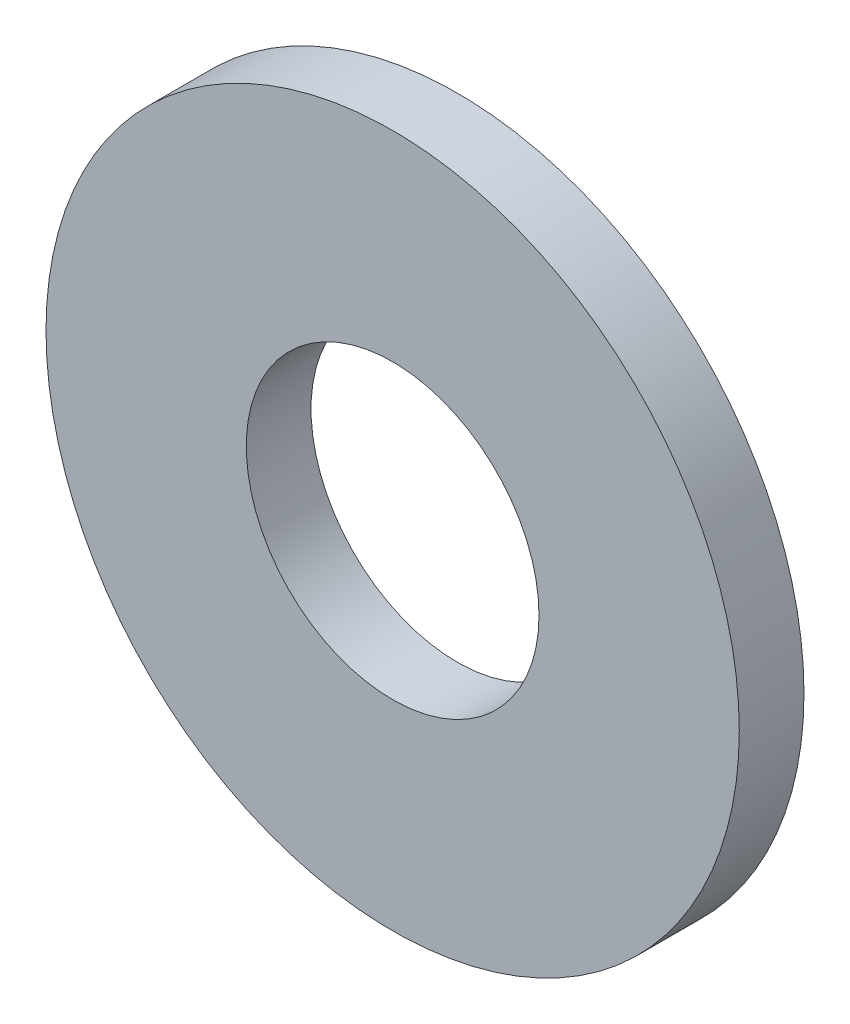
ISO-10303-21;
HEADER;
FILE_DESCRIPTION(('STEP AP214'),'2;1');
FILE_NAME('part.step','',(''),(''),'','','');
FILE_SCHEMA(('AUTOMOTIVE_DESIGN { 1 0 10303 214 1 1 1 1 }'));
ENDSEC;
DATA;
#1=APPLICATION_CONTEXT('core data for automotive mechanical design processes');
#2=APPLICATION_PROTOCOL_DEFINITION('international standard','automotive_design',2000,#1);
#3=PRODUCT_CONTEXT('',#1,'mechanical');
#4=PRODUCT('Part','Part','',(#3));
#5=PRODUCT_RELATED_PRODUCT_CATEGORY('part','',(#4));
#6=PRODUCT_DEFINITION_FORMATION('','',#4);
#7=PRODUCT_DEFINITION_CONTEXT('part definition',#1,'design');
#8=PRODUCT_DEFINITION('design','',#6,#7);
#9=PRODUCT_DEFINITION_SHAPE('','',#8);
#10=(LENGTH_UNIT() NAMED_UNIT(*) SI_UNIT(.MILLI.,.METRE.));
#11=(NAMED_UNIT(*) PLANE_ANGLE_UNIT() SI_UNIT($,.RADIAN.));
#12=(NAMED_UNIT(*) SI_UNIT($,.STERADIAN.) SOLID_ANGLE_UNIT());
#13=UNCERTAINTY_MEASURE_WITH_UNIT(LENGTH_MEASURE(1.E-05),#10,'distance_accuracy_value','');
#14=(GEOMETRIC_REPRESENTATION_CONTEXT(3) GLOBAL_UNCERTAINTY_ASSIGNED_CONTEXT((#13)) GLOBAL_UNIT_ASSIGNED_CONTEXT((#10,
#11,#12)) REPRESENTATION_CONTEXT('',''));
#15=CARTESIAN_POINT('',(0.,0.,0.));
#16=DIRECTION('',(0.,0.,1.));
#17=DIRECTION('',(1.,0.,0.));
#18=AXIS2_PLACEMENT_3D('',#15,#16,#17);
#19=CARTESIAN_POINT('',(0.,0.,1.0668));
#20=DIRECTION('',(0.,0.,1.));
#21=DIRECTION('',(1.,0.,0.));
#22=AXIS2_PLACEMENT_3D('',#19,#20,#21);
#23=PLANE('',#22);
#24=CARTESIAN_POINT('',(0.,0.,1.0668));
#25=DIRECTION('',(0.,0.,1.));
#26=DIRECTION('',(1.,0.,0.));
#27=AXIS2_PLACEMENT_3D('',#24,#25,#26);
#28=CIRCLE('',#27,5.715);
#29=CARTESIAN_POINT('',(5.715,0.,1.0668));
#30=VERTEX_POINT('',#29);
#31=EDGE_CURVE('E10',#30,#30,#28,.T.);
#32=ORIENTED_EDGE('',*,*,#31,.T.);
#33=EDGE_LOOP('',(#32));
#34=FACE_BOUND('',#33,.T.);
#35=CARTESIAN_POINT('',(0.,0.,1.0668));
#36=DIRECTION('',(0.,0.,1.));
#37=DIRECTION('',(1.,0.,0.));
#38=AXIS2_PLACEMENT_3D('',#35,#36,#37);
#39=CIRCLE('',#38,2.413);
#40=CARTESIAN_POINT('',(2.413,0.,1.0668));
#41=VERTEX_POINT('',#40);
#42=EDGE_CURVE('E43',#41,#41,#39,.T.);
#43=ORIENTED_EDGE('',*,*,#42,.F.);
#44=EDGE_LOOP('',(#43));
#45=FACE_BOUND('',#44,.T.);
#46=ADVANCED_FACE('F32',(#34,#45),#23,.T.);
#47=CARTESIAN_POINT('',(0.,0.,0.));
#48=DIRECTION('',(0.,0.,1.));
#49=DIRECTION('',(1.,0.,0.));
#50=AXIS2_PLACEMENT_3D('',#47,#48,#49);
#51=PLANE('',#50);
#52=CARTESIAN_POINT('',(0.,0.,0.));
#53=DIRECTION('',(0.,0.,1.));
#54=DIRECTION('',(1.,0.,0.));
#55=AXIS2_PLACEMENT_3D('',#52,#53,#54);
#56=CIRCLE('',#55,5.715);
#57=CARTESIAN_POINT('',(5.715,0.,0.));
#58=VERTEX_POINT('',#57);
#59=EDGE_CURVE('E36',#58,#58,#56,.T.);
#60=ORIENTED_EDGE('',*,*,#59,.F.);
#61=EDGE_LOOP('',(#60));
#62=FACE_BOUND('',#61,.T.);
#63=CARTESIAN_POINT('',(0.,0.,0.));
#64=DIRECTION('',(0.,0.,1.));
#65=DIRECTION('',(1.,0.,0.));
#66=AXIS2_PLACEMENT_3D('',#63,#64,#65);
#67=CIRCLE('',#66,2.413);
#68=CARTESIAN_POINT('',(2.413,0.,0.));
#69=VERTEX_POINT('',#68);
#70=EDGE_CURVE('E45',#69,#69,#67,.T.);
#71=ORIENTED_EDGE('',*,*,#70,.T.);
#72=EDGE_LOOP('',(#71));
#73=FACE_BOUND('',#72,.T.);
#74=ADVANCED_FACE('F55',(#62,#73),#51,.F.);
#75=CARTESIAN_POINT('',(0.,0.,1.0668));
#76=DIRECTION('',(0.,0.,-1.));
#77=DIRECTION('',(-1.,0.,0.));
#78=AXIS2_PLACEMENT_3D('',#75,#76,#77);
#79=CYLINDRICAL_SURFACE('',#78,5.715);
#80=ORIENTED_EDGE('',*,*,#31,.F.);
#81=EDGE_LOOP('',(#80));
#82=FACE_BOUND('',#81,.T.);
#83=ORIENTED_EDGE('',*,*,#59,.T.);
#84=EDGE_LOOP('',(#83));
#85=FACE_BOUND('',#84,.T.);
#86=ADVANCED_FACE('F34',(#82,#85),#79,.T.);
#87=CARTESIAN_POINT('',(0.,0.,1.0668));
#88=DIRECTION('',(0.,0.,-1.));
#89=DIRECTION('',(-1.,0.,0.));
#90=AXIS2_PLACEMENT_3D('',#87,#88,#89);
#91=CYLINDRICAL_SURFACE('',#90,2.413);
#92=ORIENTED_EDGE('',*,*,#42,.T.);
#93=EDGE_LOOP('',(#92));
#94=FACE_BOUND('',#93,.T.);
#95=ORIENTED_EDGE('',*,*,#70,.F.);
#96=EDGE_LOOP('',(#95));
#97=FACE_BOUND('',#96,.T.);
#98=ADVANCED_FACE('F51',(#94,#97),#91,.F.);
#99=CLOSED_SHELL('',(#46,#74,#86,#98));
#100=MANIFOLD_SOLID_BREP('B2',#99);
#101=ADVANCED_BREP_SHAPE_REPRESENTATION('',(#18,#100),#14);
#102=SHAPE_DEFINITION_REPRESENTATION(#9,#101);
ENDSEC;
END-ISO-10303-21;
